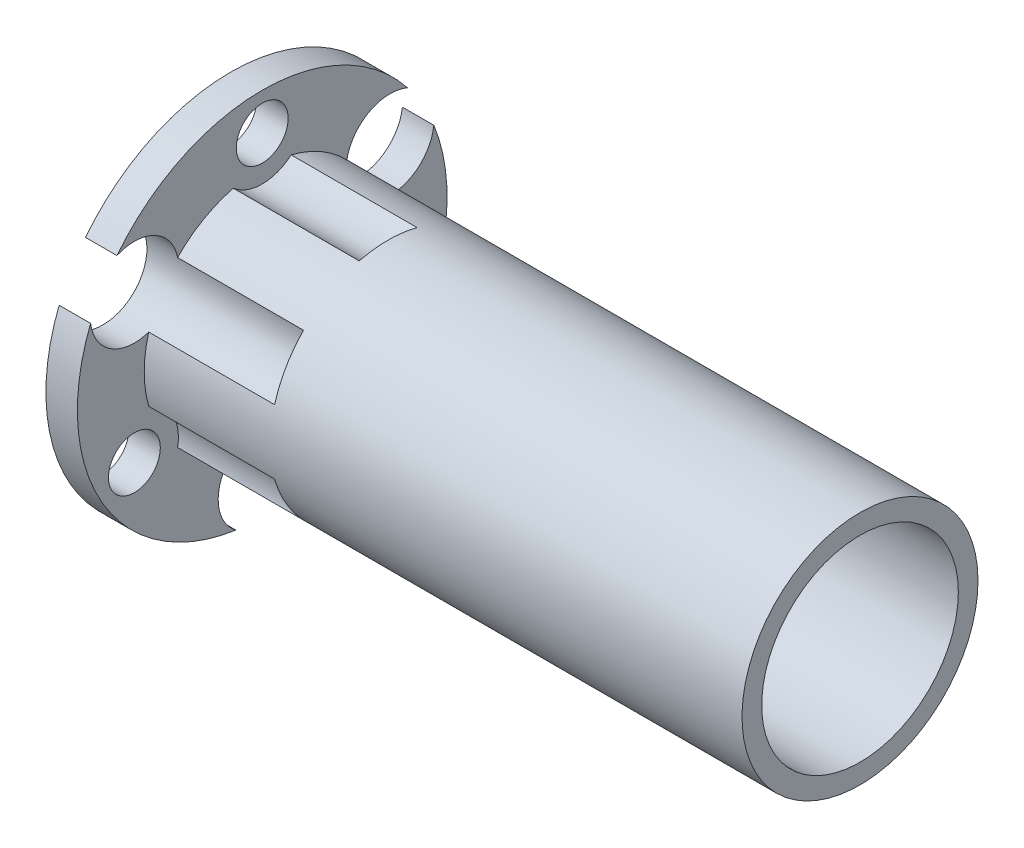
ISO-10303-21;
HEADER;
FILE_DESCRIPTION(('STEP AP214'),'2;1');
FILE_NAME('part.step','',(''),(''),'','','');
FILE_SCHEMA(('AUTOMOTIVE_DESIGN { 1 0 10303 214 1 1 1 1 }'));
ENDSEC;
DATA;
#1=APPLICATION_CONTEXT('core data for automotive mechanical design processes');
#2=APPLICATION_PROTOCOL_DEFINITION('international standard','automotive_design',2000,#1);
#3=PRODUCT_CONTEXT('',#1,'mechanical');
#4=PRODUCT('Part','Part','',(#3));
#5=PRODUCT_RELATED_PRODUCT_CATEGORY('part','',(#4));
#6=PRODUCT_DEFINITION_FORMATION('','',#4);
#7=PRODUCT_DEFINITION_CONTEXT('part definition',#1,'design');
#8=PRODUCT_DEFINITION('design','',#6,#7);
#9=PRODUCT_DEFINITION_SHAPE('','',#8);
#10=(LENGTH_UNIT() NAMED_UNIT(*) SI_UNIT(.MILLI.,.METRE.));
#11=(NAMED_UNIT(*) PLANE_ANGLE_UNIT() SI_UNIT($,.RADIAN.));
#12=(NAMED_UNIT(*) SI_UNIT($,.STERADIAN.) SOLID_ANGLE_UNIT());
#13=UNCERTAINTY_MEASURE_WITH_UNIT(LENGTH_MEASURE(1.E-05),#10,'distance_accuracy_value','');
#14=(GEOMETRIC_REPRESENTATION_CONTEXT(3) GLOBAL_UNCERTAINTY_ASSIGNED_CONTEXT((#13)) GLOBAL_UNIT_ASSIGNED_CONTEXT((#10,
#11,#12)) REPRESENTATION_CONTEXT('',''));
#15=CARTESIAN_POINT('',(0.,0.,0.));
#16=DIRECTION('',(0.,0.,1.));
#17=DIRECTION('',(1.,0.,0.));
#18=AXIS2_PLACEMENT_3D('',#15,#16,#17);
#19=CARTESIAN_POINT('',(2.,0.,0.));
#20=DIRECTION('',(-1.,0.,0.));
#21=DIRECTION('',(0.,0.,1.));
#22=AXIS2_PLACEMENT_3D('',#19,#20,#21);
#23=CYLINDRICAL_SURFACE('',#22,7.5);
#24=CARTESIAN_POINT('',(40.,0.,0.));
#25=DIRECTION('',(1.,0.,0.));
#26=DIRECTION('',(0.,0.,-1.));
#27=AXIS2_PLACEMENT_3D('',#24,#25,#26);
#28=CIRCLE('',#27,7.5);
#29=CARTESIAN_POINT('',(40.,0.,-7.5));
#30=VERTEX_POINT('',#29);
#31=EDGE_CURVE('E295',#30,#30,#28,.T.);
#32=ORIENTED_EDGE('',*,*,#31,.F.);
#33=EDGE_LOOP('',(#32));
#34=FACE_BOUND('',#33,.T.);
#35=DIRECTION('',(-1.,0.,0.));
#36=VECTOR('',#35,1.);
#37=CARTESIAN_POINT('',(6.,-7.27161561001598,1.83673798353818));
#38=LINE('',#37,#36);
#39=CARTESIAN_POINT('',(10.,-7.27161561001598,1.83673798353818));
#40=VERTEX_POINT('',#39);
#41=CARTESIAN_POINT('',(2.,-7.27161561001598,1.83673798353818));
#42=VERTEX_POINT('',#41);
#43=EDGE_CURVE('E52',#40,#42,#38,.T.);
#44=ORIENTED_EDGE('',*,*,#43,.F.);
#45=CARTESIAN_POINT('',(10.,0.,0.));
#46=DIRECTION('',(1.,0.,0.));
#47=DIRECTION('',(0.,0.,-1.));
#48=AXIS2_PLACEMENT_3D('',#45,#46,#47);
#49=CIRCLE('',#48,7.5);
#50=CARTESIAN_POINT('',(10.,-7.27161561001598,-1.83673798353818));
#51=VERTEX_POINT('',#50);
#52=EDGE_CURVE('E11',#40,#51,#49,.T.);
#53=ORIENTED_EDGE('',*,*,#52,.T.);
#54=DIRECTION('',(-1.,0.,0.));
#55=VECTOR('',#54,1.);
#56=CARTESIAN_POINT('',(6.,-7.27161561001598,-1.83673798353818));
#57=LINE('',#56,#55);
#58=CARTESIAN_POINT('',(2.,-7.27161561001598,-1.83673798353818));
#59=VERTEX_POINT('',#58);
#60=EDGE_CURVE('E182',#59,#51,#57,.F.);
#61=ORIENTED_EDGE('',*,*,#60,.F.);
#62=CARTESIAN_POINT('',(2.,0.,0.));
#63=DIRECTION('',(1.,0.,0.));
#64=DIRECTION('',(0.,0.,-1.));
#65=AXIS2_PLACEMENT_3D('',#62,#63,#64);
#66=CIRCLE('',#65,7.5);
#67=CARTESIAN_POINT('',(2.,-5.22646955884792,-5.37903485306017));
#68=VERTEX_POINT('',#67);
#69=EDGE_CURVE('E379',#68,#59,#66,.F.);
#70=ORIENTED_EDGE('',*,*,#69,.F.);
#71=DIRECTION('',(-1.,0.,0.));
#72=VECTOR('',#71,1.);
#73=CARTESIAN_POINT('',(10.,-5.22646955884792,-5.37903485306017));
#74=LINE('',#73,#72);
#75=CARTESIAN_POINT('',(10.,-5.22646955884792,-5.37903485306017));
#76=VERTEX_POINT('',#75);
#77=EDGE_CURVE('E328',#76,#68,#74,.T.);
#78=ORIENTED_EDGE('',*,*,#77,.F.);
#79=CARTESIAN_POINT('',(10.,0.,0.));
#80=DIRECTION('',(1.,0.,0.));
#81=DIRECTION('',(0.,0.,-1.));
#82=AXIS2_PLACEMENT_3D('',#79,#80,#81);
#83=CIRCLE('',#82,7.5);
#84=CARTESIAN_POINT('',(10.,-2.04514605116821,-7.21577283659838));
#85=VERTEX_POINT('',#84);
#86=EDGE_CURVE('E335',#76,#85,#83,.T.);
#87=ORIENTED_EDGE('',*,*,#86,.T.);
#88=DIRECTION('',(-1.,0.,0.));
#89=VECTOR('',#88,1.);
#90=CARTESIAN_POINT('',(10.,-2.04514605116821,-7.21577283659838));
#91=LINE('',#90,#89);
#92=CARTESIAN_POINT('',(2.,-2.04514605116821,-7.21577283659838));
#93=VERTEX_POINT('',#92);
#94=EDGE_CURVE('E339',#85,#93,#91,.T.);
#95=ORIENTED_EDGE('',*,*,#94,.T.);
#96=CARTESIAN_POINT('',(2.,2.04514605116806,-7.21577283659843));
#97=VERTEX_POINT('',#96);
#98=EDGE_CURVE('E380',#97,#93,#66,.F.);
#99=ORIENTED_EDGE('',*,*,#98,.F.);
#100=DIRECTION('',(-1.,0.,0.));
#101=VECTOR('',#100,1.);
#102=CARTESIAN_POINT('',(10.,2.04514605116806,-7.21577283659843));
#103=LINE('',#102,#101);
#104=CARTESIAN_POINT('',(10.,2.04514605116806,-7.21577283659843));
#105=VERTEX_POINT('',#104);
#106=EDGE_CURVE('E342',#105,#97,#103,.T.);
#107=ORIENTED_EDGE('',*,*,#106,.F.);
#108=CARTESIAN_POINT('',(10.,0.,0.));
#109=DIRECTION('',(1.,0.,0.));
#110=DIRECTION('',(0.,0.,-1.));
#111=AXIS2_PLACEMENT_3D('',#108,#109,#110);
#112=CIRCLE('',#111,7.5);
#113=CARTESIAN_POINT('',(10.,5.22646955884781,-5.37903485306028));
#114=VERTEX_POINT('',#113);
#115=EDGE_CURVE('E351',#105,#114,#112,.T.);
#116=ORIENTED_EDGE('',*,*,#115,.T.);
#117=DIRECTION('',(-1.,0.,0.));
#118=VECTOR('',#117,1.);
#119=CARTESIAN_POINT('',(10.,5.22646955884781,-5.37903485306028));
#120=LINE('',#119,#118);
#121=CARTESIAN_POINT('',(2.,5.22646955884781,-5.37903485306028));
#122=VERTEX_POINT('',#121);
#123=EDGE_CURVE('E356',#114,#122,#120,.T.);
#124=ORIENTED_EDGE('',*,*,#123,.T.);
#125=CARTESIAN_POINT('',(2.,7.27161561001597,-1.83673798353823));
#126=VERTEX_POINT('',#125);
#127=EDGE_CURVE('E192',#126,#122,#66,.F.);
#128=ORIENTED_EDGE('',*,*,#127,.F.);
#129=DIRECTION('',(-1.,0.,0.));
#130=VECTOR('',#129,1.);
#131=CARTESIAN_POINT('',(10.,7.27161561001597,-1.83673798353823));
#132=LINE('',#131,#130);
#133=CARTESIAN_POINT('',(10.,7.27161561001597,-1.83673798353823));
#134=VERTEX_POINT('',#133);
#135=EDGE_CURVE('E352',#134,#126,#132,.T.);
#136=ORIENTED_EDGE('',*,*,#135,.F.);
#137=CARTESIAN_POINT('',(10.,0.,0.));
#138=DIRECTION('',(1.,0.,0.));
#139=DIRECTION('',(0.,0.,-1.));
#140=AXIS2_PLACEMENT_3D('',#137,#138,#139);
#141=CIRCLE('',#140,7.5);
#142=CARTESIAN_POINT('',(10.,7.271615610016,1.83673798353813));
#143=VERTEX_POINT('',#142);
#144=EDGE_CURVE('E365',#134,#143,#141,.T.);
#145=ORIENTED_EDGE('',*,*,#144,.T.);
#146=DIRECTION('',(-1.,0.,0.));
#147=VECTOR('',#146,1.);
#148=CARTESIAN_POINT('',(10.,7.271615610016,1.83673798353813));
#149=LINE('',#148,#147);
#150=CARTESIAN_POINT('',(2.,7.271615610016,1.83673798353813));
#151=VERTEX_POINT('',#150);
#152=EDGE_CURVE('E368',#143,#151,#149,.T.);
#153=ORIENTED_EDGE('',*,*,#152,.T.);
#154=CARTESIAN_POINT('',(2.,5.22646955884788,5.37903485306021));
#155=VERTEX_POINT('',#154);
#156=EDGE_CURVE('E191',#155,#151,#66,.F.);
#157=ORIENTED_EDGE('',*,*,#156,.F.);
#158=DIRECTION('',(-1.,0.,0.));
#159=VECTOR('',#158,1.);
#160=CARTESIAN_POINT('',(10.,5.22646955884788,5.37903485306021));
#161=LINE('',#160,#159);
#162=CARTESIAN_POINT('',(10.,5.22646955884788,5.37903485306021));
#163=VERTEX_POINT('',#162);
#164=EDGE_CURVE('E317',#163,#155,#161,.T.);
#165=ORIENTED_EDGE('',*,*,#164,.F.);
#166=CARTESIAN_POINT('',(10.,0.,0.));
#167=DIRECTION('',(1.,0.,0.));
#168=DIRECTION('',(0.,0.,-1.));
#169=AXIS2_PLACEMENT_3D('',#166,#167,#168);
#170=CIRCLE('',#169,7.5);
#171=CARTESIAN_POINT('',(10.,2.04514605116816,7.2157728365984));
#172=VERTEX_POINT('',#171);
#173=EDGE_CURVE('E310',#163,#172,#170,.T.);
#174=ORIENTED_EDGE('',*,*,#173,.T.);
#175=DIRECTION('',(-1.,0.,0.));
#176=VECTOR('',#175,1.);
#177=CARTESIAN_POINT('',(10.,2.04514605116816,7.2157728365984));
#178=LINE('',#177,#176);
#179=CARTESIAN_POINT('',(2.,2.04514605116816,7.2157728365984));
#180=VERTEX_POINT('',#179);
#181=EDGE_CURVE('E314',#172,#180,#178,.T.);
#182=ORIENTED_EDGE('',*,*,#181,.T.);
#183=CARTESIAN_POINT('',(2.,-2.04514605116801,7.21577283659844));
#184=VERTEX_POINT('',#183);
#185=EDGE_CURVE('E189',#184,#180,#66,.F.);
#186=ORIENTED_EDGE('',*,*,#185,.F.);
#187=DIRECTION('',(-1.,0.,0.));
#188=VECTOR('',#187,1.);
#189=CARTESIAN_POINT('',(10.,-2.045146051168,7.21577283659844));
#190=LINE('',#189,#188);
#191=CARTESIAN_POINT('',(10.,-2.045146051168,7.21577283659844));
#192=VERTEX_POINT('',#191);
#193=EDGE_CURVE('E296',#192,#184,#190,.T.);
#194=ORIENTED_EDGE('',*,*,#193,.F.);
#195=CARTESIAN_POINT('',(10.,0.,0.));
#196=DIRECTION('',(1.,0.,0.));
#197=DIRECTION('',(0.,0.,-1.));
#198=AXIS2_PLACEMENT_3D('',#195,#196,#197);
#199=CIRCLE('',#198,7.5);
#200=CARTESIAN_POINT('',(10.,-5.22646955884777,5.37903485306032));
#201=VERTEX_POINT('',#200);
#202=EDGE_CURVE('E324',#192,#201,#199,.T.);
#203=ORIENTED_EDGE('',*,*,#202,.T.);
#204=DIRECTION('',(-1.,0.,0.));
#205=VECTOR('',#204,1.);
#206=CARTESIAN_POINT('',(10.,-5.22646955884777,5.37903485306032));
#207=LINE('',#206,#205);
#208=CARTESIAN_POINT('',(2.,-5.22646955884777,5.37903485306032));
#209=VERTEX_POINT('',#208);
#210=EDGE_CURVE('E186',#201,#209,#207,.T.);
#211=ORIENTED_EDGE('',*,*,#210,.T.);
#212=EDGE_CURVE('E184',#42,#209,#66,.F.);
#213=ORIENTED_EDGE('',*,*,#212,.F.);
#214=EDGE_LOOP('',(#44,#53,#61,#70,#78,#87,#95,#99,#107,#116,#124,#128,#136,#145,#153,#157,#165,
#174,#182,#186,#194,#203,#211,#213));
#215=FACE_BOUND('',#214,.T.);
#216=ADVANCED_FACE('F43',(#34,#215),#23,.T.);
#217=CARTESIAN_POINT('',(2.,0.,0.));
#218=DIRECTION('',(1.,0.,0.));
#219=DIRECTION('',(0.,0.,-1.));
#220=AXIS2_PLACEMENT_3D('',#217,#218,#219);
#221=PLANE('',#220);
#222=CARTESIAN_POINT('',(2.,-4.6925,8.12764841451695));
#223=DIRECTION('',(1.,0.,0.));
#224=DIRECTION('',(0.,0.,-1.));
#225=AXIS2_PLACEMENT_3D('',#222,#223,#224);
#226=CIRCLE('',#225,1.65);
#227=CARTESIAN_POINT('',(2.,-4.6925,6.47764841451695));
#228=VERTEX_POINT('',#227);
#229=EDGE_CURVE('E217',#228,#228,#226,.T.);
#230=ORIENTED_EDGE('',*,*,#229,.F.);
#231=EDGE_LOOP('',(#230));
#232=FACE_BOUND('',#231,.T.);
#233=CARTESIAN_POINT('',(2.,-9.385,0.));
#234=DIRECTION('',(1.,0.,0.));
#235=DIRECTION('',(0.,0.,-1.));
#236=AXIS2_PLACEMENT_3D('',#233,#234,#235);
#237=CIRCLE('',#236,2.8);
#238=CARTESIAN_POINT('',(2.,-11.630299680341,1.6729104415541));
#239=VERTEX_POINT('',#238);
#240=EDGE_CURVE('E177',#42,#239,#237,.T.);
#241=ORIENTED_EDGE('',*,*,#240,.F.);
#242=ORIENTED_EDGE('',*,*,#212,.T.);
#243=CARTESIAN_POINT('',(2.,-4.69249999999986,8.12764841451703));
#244=DIRECTION('',(1.,0.,0.));
#245=DIRECTION('',(0.,0.,-1.));
#246=AXIS2_PLACEMENT_3D('',#243,#244,#245);
#247=CIRCLE('',#246,2.8);
#248=EDGE_CURVE('E67',#209,#184,#247,.T.);
#249=ORIENTED_EDGE('',*,*,#248,.T.);
#250=ORIENTED_EDGE('',*,*,#185,.T.);
#251=CARTESIAN_POINT('',(2.,4.69250000000004,8.12764841451694));
#252=DIRECTION('',(1.,0.,0.));
#253=DIRECTION('',(0.,0.,-1.));
#254=AXIS2_PLACEMENT_3D('',#251,#252,#253);
#255=CIRCLE('',#254,2.8);
#256=CARTESIAN_POINT('',(2.,4.36636689952844,10.9085901975783));
#257=VERTEX_POINT('',#256);
#258=EDGE_CURVE('E207',#257,#180,#255,.T.);
#259=ORIENTED_EDGE('',*,*,#258,.F.);
#260=CARTESIAN_POINT('',(2.,0.,0.));
#261=DIRECTION('',(1.,0.,0.));
#262=DIRECTION('',(0.,0.,-1.));
#263=AXIS2_PLACEMENT_3D('',#260,#261,#262);
#264=CIRCLE('',#263,11.75);
#265=EDGE_CURVE('E196',#257,#239,#264,.T.);
#266=ORIENTED_EDGE('',*,*,#265,.T.);
#267=EDGE_LOOP('',(#241,#242,#249,#250,#259,#266));
#268=FACE_BOUND('',#267,.T.);
#269=ADVANCED_FACE('F193',(#232,#268),#221,.T.);
#270=CARTESIAN_POINT('',(2.,9.385,0.));
#271=DIRECTION('',(1.,0.,0.));
#272=DIRECTION('',(0.,0.,-1.));
#273=AXIS2_PLACEMENT_3D('',#270,#271,#272);
#274=CIRCLE('',#273,1.65);
#275=CARTESIAN_POINT('',(2.,9.385,-1.65));
#276=VERTEX_POINT('',#275);
#277=EDGE_CURVE('E225',#276,#276,#274,.T.);
#278=ORIENTED_EDGE('',*,*,#277,.F.);
#279=EDGE_LOOP('',(#278));
#280=FACE_BOUND('',#279,.T.);
#281=CARTESIAN_POINT('',(2.,4.69250000000004,8.12764841451694));
#282=DIRECTION('',(1.,0.,0.));
#283=DIRECTION('',(0.,0.,-1.));
#284=AXIS2_PLACEMENT_3D('',#281,#282,#283);
#285=CIRCLE('',#284,2.8);
#286=CARTESIAN_POINT('',(2.,7.26393278081262,9.23567975602423));
#287=VERTEX_POINT('',#286);
#288=EDGE_CURVE('E389',#155,#287,#285,.T.);
#289=ORIENTED_EDGE('',*,*,#288,.F.);
#290=ORIENTED_EDGE('',*,*,#156,.T.);
#291=CARTESIAN_POINT('',(2.,9.385,0.));
#292=DIRECTION('',(1.,0.,0.));
#293=DIRECTION('',(0.,0.,-1.));
#294=AXIS2_PLACEMENT_3D('',#291,#292,#293);
#295=CIRCLE('',#294,2.8);
#296=EDGE_CURVE('E320',#151,#126,#295,.T.);
#297=ORIENTED_EDGE('',*,*,#296,.T.);
#298=ORIENTED_EDGE('',*,*,#127,.T.);
#299=CARTESIAN_POINT('',(2.,4.69249999999993,-8.127648414517));
#300=DIRECTION('',(1.,0.,0.));
#301=DIRECTION('',(0.,0.,-1.));
#302=AXIS2_PLACEMENT_3D('',#299,#300,#301);
#303=CIRCLE('',#302,2.8);
#304=CARTESIAN_POINT('',(2.,7.26393278081249,-9.23567975602434));
#305=VERTEX_POINT('',#304);
#306=EDGE_CURVE('E267',#305,#122,#303,.T.);
#307=ORIENTED_EDGE('',*,*,#306,.F.);
#308=CARTESIAN_POINT('',(2.,0.,0.));
#309=DIRECTION('',(1.,0.,0.));
#310=DIRECTION('',(0.,0.,-1.));
#311=AXIS2_PLACEMENT_3D('',#308,#309,#310);
#312=CIRCLE('',#311,11.75);
#313=EDGE_CURVE('E386',#305,#287,#312,.T.);
#314=ORIENTED_EDGE('',*,*,#313,.T.);
#315=EDGE_LOOP('',(#289,#290,#297,#298,#307,#314));
#316=FACE_BOUND('',#315,.T.);
#317=ADVANCED_FACE('F433',(#280,#316),#221,.T.);
#318=CARTESIAN_POINT('',(2.,-4.6925,-8.12764841451696));
#319=DIRECTION('',(1.,0.,0.));
#320=DIRECTION('',(0.,0.,-1.));
#321=AXIS2_PLACEMENT_3D('',#318,#319,#320);
#322=CIRCLE('',#321,1.65);
#323=CARTESIAN_POINT('',(2.,-4.6925,-9.77764841451696));
#324=VERTEX_POINT('',#323);
#325=EDGE_CURVE('E221',#324,#324,#322,.T.);
#326=ORIENTED_EDGE('',*,*,#325,.F.);
#327=EDGE_LOOP('',(#326));
#328=FACE_BOUND('',#327,.T.);
#329=CARTESIAN_POINT('',(2.,4.69249999999993,-8.127648414517));
#330=DIRECTION('',(1.,0.,0.));
#331=DIRECTION('',(0.,0.,-1.));
#332=AXIS2_PLACEMENT_3D('',#329,#330,#331);
#333=CIRCLE('',#332,2.8);
#334=CARTESIAN_POINT('',(2.,4.36636689952829,-10.9085901975784));
#335=VERTEX_POINT('',#334);
#336=EDGE_CURVE('E213',#97,#335,#333,.T.);
#337=ORIENTED_EDGE('',*,*,#336,.F.);
#338=ORIENTED_EDGE('',*,*,#98,.T.);
#339=CARTESIAN_POINT('',(2.,-4.69250000000009,-8.1276484145169));
#340=DIRECTION('',(1.,0.,0.));
#341=DIRECTION('',(0.,0.,-1.));
#342=AXIS2_PLACEMENT_3D('',#339,#340,#341);
#343=CIRCLE('',#342,2.8);
#344=EDGE_CURVE('E59',#93,#68,#343,.T.);
#345=ORIENTED_EDGE('',*,*,#344,.T.);
#346=ORIENTED_EDGE('',*,*,#69,.T.);
#347=CARTESIAN_POINT('',(2.,-9.385,0.));
#348=DIRECTION('',(1.,0.,0.));
#349=DIRECTION('',(0.,0.,-1.));
#350=AXIS2_PLACEMENT_3D('',#347,#348,#349);
#351=CIRCLE('',#350,2.8);
#352=CARTESIAN_POINT('',(2.,-11.630299680341,-1.6729104415541));
#353=VERTEX_POINT('',#352);
#354=EDGE_CURVE('E199',#353,#59,#351,.T.);
#355=ORIENTED_EDGE('',*,*,#354,.F.);
#356=CARTESIAN_POINT('',(2.,0.,0.));
#357=DIRECTION('',(1.,0.,0.));
#358=DIRECTION('',(0.,0.,-1.));
#359=AXIS2_PLACEMENT_3D('',#356,#357,#358);
#360=CIRCLE('',#359,11.75);
#361=EDGE_CURVE('E205',#353,#335,#360,.T.);
#362=ORIENTED_EDGE('',*,*,#361,.T.);
#363=EDGE_LOOP('',(#337,#338,#345,#346,#355,#362));
#364=FACE_BOUND('',#363,.T.);
#365=ADVANCED_FACE('F407',(#328,#364),#221,.T.);
#366=CARTESIAN_POINT('',(2.,0.,0.));
#367=DIRECTION('',(-1.,0.,0.));
#368=DIRECTION('',(0.,0.,1.));
#369=AXIS2_PLACEMENT_3D('',#366,#367,#368);
#370=CYLINDRICAL_SURFACE('',#369,11.75);
#371=CARTESIAN_POINT('',(0.,0.,0.));
#372=DIRECTION('',(1.,0.,0.));
#373=DIRECTION('',(0.,0.,-1.));
#374=AXIS2_PLACEMENT_3D('',#371,#372,#373);
#375=CIRCLE('',#374,11.75);
#376=CARTESIAN_POINT('',(0.,7.26393278081249,-9.23567975602434));
#377=VERTEX_POINT('',#376);
#378=CARTESIAN_POINT('',(0.,7.26393278081262,9.23567975602423));
#379=VERTEX_POINT('',#378);
#380=EDGE_CURVE('E188',#377,#379,#375,.T.);
#381=ORIENTED_EDGE('',*,*,#380,.T.);
#382=DIRECTION('',(-1.,0.,0.));
#383=VECTOR('',#382,1.);
#384=CARTESIAN_POINT('',(2.,7.26393278081262,9.23567975602423));
#385=LINE('',#384,#383);
#386=EDGE_CURVE('E279',#287,#379,#385,.T.);
#387=ORIENTED_EDGE('',*,*,#386,.F.);
#388=ORIENTED_EDGE('',*,*,#313,.F.);
#389=DIRECTION('',(-1.,0.,0.));
#390=VECTOR('',#389,1.);
#391=CARTESIAN_POINT('',(2.,7.26393278081249,-9.23567975602434));
#392=LINE('',#391,#390);
#393=EDGE_CURVE('E283',#305,#377,#392,.T.);
#394=ORIENTED_EDGE('',*,*,#393,.T.);
#395=EDGE_LOOP('',(#381,#387,#388,#394));
#396=FACE_BOUND('',#395,.T.);
#397=ADVANCED_FACE('F45',(#396),#370,.T.);
#398=CARTESIAN_POINT('',(2.,4.69250000000004,8.12764841451694));
#399=DIRECTION('',(-1.,0.,0.));
#400=DIRECTION('',(0.,0.,1.));
#401=AXIS2_PLACEMENT_3D('',#398,#399,#400);
#402=CYLINDRICAL_SURFACE('',#401,2.8);
#403=CARTESIAN_POINT('',(0.,4.69250000000004,8.12764841451694));
#404=DIRECTION('',(1.,0.,0.));
#405=DIRECTION('',(0.,0.,-1.));
#406=AXIS2_PLACEMENT_3D('',#403,#404,#405);
#407=CIRCLE('',#406,2.8);
#408=CARTESIAN_POINT('',(0.,4.36636689952844,10.9085901975783));
#409=VERTEX_POINT('',#408);
#410=EDGE_CURVE('E233',#409,#379,#407,.T.);
#411=ORIENTED_EDGE('',*,*,#410,.F.);
#412=DIRECTION('',(-1.,0.,0.));
#413=VECTOR('',#412,1.);
#414=CARTESIAN_POINT('',(2.,4.36636689952844,10.9085901975783));
#415=LINE('',#414,#413);
#416=EDGE_CURVE('E276',#257,#409,#415,.T.);
#417=ORIENTED_EDGE('',*,*,#416,.F.);
#418=ORIENTED_EDGE('',*,*,#258,.T.);
#419=ORIENTED_EDGE('',*,*,#181,.F.);
#420=CARTESIAN_POINT('',(10.,4.69250000000004,8.12764841451694));
#421=DIRECTION('',(1.,0.,0.));
#422=DIRECTION('',(0.,0.,-1.));
#423=AXIS2_PLACEMENT_3D('',#420,#421,#422);
#424=CIRCLE('',#423,2.8);
#425=EDGE_CURVE('E306',#172,#163,#424,.T.);
#426=ORIENTED_EDGE('',*,*,#425,.T.);
#427=ORIENTED_EDGE('',*,*,#164,.T.);
#428=ORIENTED_EDGE('',*,*,#288,.T.);
#429=ORIENTED_EDGE('',*,*,#386,.T.);
#430=EDGE_LOOP('',(#411,#417,#418,#419,#426,#427,#428,#429));
#431=FACE_BOUND('',#430,.T.);
#432=ADVANCED_FACE('F396',(#431),#402,.F.);
#433=CARTESIAN_POINT('',(2.,0.,0.));
#434=DIRECTION('',(-1.,0.,0.));
#435=DIRECTION('',(0.,0.,1.));
#436=AXIS2_PLACEMENT_3D('',#433,#434,#435);
#437=CYLINDRICAL_SURFACE('',#436,11.75);
#438=CARTESIAN_POINT('',(0.,0.,0.));
#439=DIRECTION('',(1.,0.,0.));
#440=DIRECTION('',(0.,0.,-1.));
#441=AXIS2_PLACEMENT_3D('',#438,#439,#440);
#442=CIRCLE('',#441,11.75);
#443=CARTESIAN_POINT('',(0.,-11.630299680341,1.6729104415541));
#444=VERTEX_POINT('',#443);
#445=EDGE_CURVE('E236',#409,#444,#442,.T.);
#446=ORIENTED_EDGE('',*,*,#445,.T.);
#447=DIRECTION('',(-1.,0.,0.));
#448=VECTOR('',#447,1.);
#449=CARTESIAN_POINT('',(2.,-11.630299680341,1.6729104415541));
#450=LINE('',#449,#448);
#451=EDGE_CURVE('E273',#239,#444,#450,.T.);
#452=ORIENTED_EDGE('',*,*,#451,.F.);
#453=ORIENTED_EDGE('',*,*,#265,.F.);
#454=ORIENTED_EDGE('',*,*,#416,.T.);
#455=EDGE_LOOP('',(#446,#452,#453,#454));
#456=FACE_BOUND('',#455,.T.);
#457=ADVANCED_FACE('F452',(#456),#437,.T.);
#458=CARTESIAN_POINT('',(2.,-9.385,0.));
#459=DIRECTION('',(-1.,0.,0.));
#460=DIRECTION('',(0.,0.,1.));
#461=AXIS2_PLACEMENT_3D('',#458,#459,#460);
#462=CYLINDRICAL_SURFACE('',#461,2.8);
#463=CARTESIAN_POINT('',(0.,-9.385,0.));
#464=DIRECTION('',(1.,0.,0.));
#465=DIRECTION('',(0.,0.,-1.));
#466=AXIS2_PLACEMENT_3D('',#463,#464,#465);
#467=CIRCLE('',#466,2.8);
#468=CARTESIAN_POINT('',(0.,-11.630299680341,-1.6729104415541));
#469=VERTEX_POINT('',#468);
#470=EDGE_CURVE('E240',#469,#444,#467,.T.);
#471=ORIENTED_EDGE('',*,*,#470,.F.);
#472=DIRECTION('',(-1.,0.,0.));
#473=VECTOR('',#472,1.);
#474=CARTESIAN_POINT('',(2.,-11.630299680341,-1.6729104415541));
#475=LINE('',#474,#473);
#476=EDGE_CURVE('E270',#353,#469,#475,.T.);
#477=ORIENTED_EDGE('',*,*,#476,.F.);
#478=ORIENTED_EDGE('',*,*,#354,.T.);
#479=ORIENTED_EDGE('',*,*,#60,.T.);
#480=CARTESIAN_POINT('',(10.,-9.385,0.));
#481=DIRECTION('',(1.,0.,0.));
#482=DIRECTION('',(0.,0.,-1.));
#483=AXIS2_PLACEMENT_3D('',#480,#481,#482);
#484=CIRCLE('',#483,2.8);
#485=EDGE_CURVE('E179',#51,#40,#484,.T.);
#486=ORIENTED_EDGE('',*,*,#485,.T.);
#487=ORIENTED_EDGE('',*,*,#43,.T.);
#488=ORIENTED_EDGE('',*,*,#240,.T.);
#489=ORIENTED_EDGE('',*,*,#451,.T.);
#490=EDGE_LOOP('',(#471,#477,#478,#479,#486,#487,#488,#489));
#491=FACE_BOUND('',#490,.T.);
#492=ADVANCED_FACE('F174',(#491),#462,.F.);
#493=CARTESIAN_POINT('',(2.,0.,0.));
#494=DIRECTION('',(-1.,0.,0.));
#495=DIRECTION('',(0.,0.,1.));
#496=AXIS2_PLACEMENT_3D('',#493,#494,#495);
#497=CYLINDRICAL_SURFACE('',#496,11.75);
#498=CARTESIAN_POINT('',(0.,0.,0.));
#499=DIRECTION('',(1.,0.,0.));
#500=DIRECTION('',(0.,0.,-1.));
#501=AXIS2_PLACEMENT_3D('',#498,#499,#500);
#502=CIRCLE('',#501,11.75);
#503=CARTESIAN_POINT('',(0.,4.36636689952829,-10.9085901975784));
#504=VERTEX_POINT('',#503);
#505=EDGE_CURVE('E243',#469,#504,#502,.T.);
#506=ORIENTED_EDGE('',*,*,#505,.T.);
#507=DIRECTION('',(-1.,0.,0.));
#508=VECTOR('',#507,1.);
#509=CARTESIAN_POINT('',(2.,4.36636689952829,-10.9085901975784));
#510=LINE('',#509,#508);
#511=EDGE_CURVE('E229',#335,#504,#510,.T.);
#512=ORIENTED_EDGE('',*,*,#511,.F.);
#513=ORIENTED_EDGE('',*,*,#361,.F.);
#514=ORIENTED_EDGE('',*,*,#476,.T.);
#515=EDGE_LOOP('',(#506,#512,#513,#514));
#516=FACE_BOUND('',#515,.T.);
#517=ADVANCED_FACE('F445',(#516),#497,.T.);
#518=CARTESIAN_POINT('',(2.,4.69249999999993,-8.127648414517));
#519=DIRECTION('',(-1.,0.,0.));
#520=DIRECTION('',(0.,0.,1.));
#521=AXIS2_PLACEMENT_3D('',#518,#519,#520);
#522=CYLINDRICAL_SURFACE('',#521,2.8);
#523=CARTESIAN_POINT('',(0.,4.69249999999993,-8.127648414517));
#524=DIRECTION('',(1.,0.,0.));
#525=DIRECTION('',(0.,0.,-1.));
#526=AXIS2_PLACEMENT_3D('',#523,#524,#525);
#527=CIRCLE('',#526,2.8);
#528=EDGE_CURVE('E247',#377,#504,#527,.T.);
#529=ORIENTED_EDGE('',*,*,#528,.F.);
#530=ORIENTED_EDGE('',*,*,#393,.F.);
#531=ORIENTED_EDGE('',*,*,#306,.T.);
#532=ORIENTED_EDGE('',*,*,#123,.F.);
#533=CARTESIAN_POINT('',(10.,4.69249999999993,-8.127648414517));
#534=DIRECTION('',(1.,0.,0.));
#535=DIRECTION('',(0.,0.,-1.));
#536=AXIS2_PLACEMENT_3D('',#533,#534,#535);
#537=CIRCLE('',#536,2.8);
#538=EDGE_CURVE('E347',#114,#105,#537,.T.);
#539=ORIENTED_EDGE('',*,*,#538,.T.);
#540=ORIENTED_EDGE('',*,*,#106,.T.);
#541=ORIENTED_EDGE('',*,*,#336,.T.);
#542=ORIENTED_EDGE('',*,*,#511,.T.);
#543=EDGE_LOOP('',(#529,#530,#531,#532,#539,#540,#541,#542));
#544=FACE_BOUND('',#543,.T.);
#545=ADVANCED_FACE('F441',(#544),#522,.F.);
#546=CARTESIAN_POINT('',(2.,-4.6925,-8.12764841451696));
#547=DIRECTION('',(-1.,0.,0.));
#548=DIRECTION('',(0.,0.,1.));
#549=AXIS2_PLACEMENT_3D('',#546,#547,#548);
#550=CYLINDRICAL_SURFACE('',#549,1.65);
#551=ORIENTED_EDGE('',*,*,#325,.T.);
#552=EDGE_LOOP('',(#551));
#553=FACE_BOUND('',#552,.T.);
#554=CARTESIAN_POINT('',(0.,-4.6925,-8.12764841451696));
#555=DIRECTION('',(1.,0.,0.));
#556=DIRECTION('',(0.,0.,-1.));
#557=AXIS2_PLACEMENT_3D('',#554,#555,#556);
#558=CIRCLE('',#557,1.65);
#559=CARTESIAN_POINT('',(0.,-4.6925,-9.77764841451696));
#560=VERTEX_POINT('',#559);
#561=EDGE_CURVE('E259',#560,#560,#558,.T.);
#562=ORIENTED_EDGE('',*,*,#561,.F.);
#563=EDGE_LOOP('',(#562));
#564=FACE_BOUND('',#563,.T.);
#565=ADVANCED_FACE('F444',(#553,#564),#550,.F.);
#566=CARTESIAN_POINT('',(2.,-4.6925,8.12764841451695));
#567=DIRECTION('',(-1.,0.,0.));
#568=DIRECTION('',(0.,0.,1.));
#569=AXIS2_PLACEMENT_3D('',#566,#567,#568);
#570=CYLINDRICAL_SURFACE('',#569,1.65);
#571=ORIENTED_EDGE('',*,*,#229,.T.);
#572=EDGE_LOOP('',(#571));
#573=FACE_BOUND('',#572,.T.);
#574=CARTESIAN_POINT('',(0.,-4.6925,8.12764841451695));
#575=DIRECTION('',(1.,0.,0.));
#576=DIRECTION('',(0.,0.,-1.));
#577=AXIS2_PLACEMENT_3D('',#574,#575,#576);
#578=CIRCLE('',#577,1.65);
#579=CARTESIAN_POINT('',(0.,-4.6925,6.47764841451695));
#580=VERTEX_POINT('',#579);
#581=EDGE_CURVE('E255',#580,#580,#578,.T.);
#582=ORIENTED_EDGE('',*,*,#581,.F.);
#583=EDGE_LOOP('',(#582));
#584=FACE_BOUND('',#583,.T.);
#585=ADVANCED_FACE('F511',(#573,#584),#570,.F.);
#586=CARTESIAN_POINT('',(2.,0.,0.));
#587=DIRECTION('',(-1.,0.,0.));
#588=DIRECTION('',(0.,0.,1.));
#589=AXIS2_PLACEMENT_3D('',#586,#587,#588);
#590=CYLINDRICAL_SURFACE('',#589,6.25);
#591=CARTESIAN_POINT('',(0.,0.,0.));
#592=DIRECTION('',(1.,0.,0.));
#593=DIRECTION('',(0.,0.,-1.));
#594=AXIS2_PLACEMENT_3D('',#591,#592,#593);
#595=CIRCLE('',#594,6.25);
#596=CARTESIAN_POINT('',(0.,0.,-6.25));
#597=VERTEX_POINT('',#596);
#598=EDGE_CURVE('E251',#597,#597,#595,.T.);
#599=ORIENTED_EDGE('',*,*,#598,.F.);
#600=EDGE_LOOP('',(#599));
#601=FACE_BOUND('',#600,.T.);
#602=CARTESIAN_POINT('',(40.,0.,0.));
#603=DIRECTION('',(1.,0.,0.));
#604=DIRECTION('',(0.,0.,-1.));
#605=AXIS2_PLACEMENT_3D('',#602,#603,#604);
#606=CIRCLE('',#605,6.25);
#607=CARTESIAN_POINT('',(40.,0.,-6.25));
#608=VERTEX_POINT('',#607);
#609=EDGE_CURVE('E301',#608,#608,#606,.T.);
#610=ORIENTED_EDGE('',*,*,#609,.T.);
#611=EDGE_LOOP('',(#610));
#612=FACE_BOUND('',#611,.T.);
#613=ADVANCED_FACE('F439',(#601,#612),#590,.F.);
#614=CARTESIAN_POINT('',(2.,9.385,0.));
#615=DIRECTION('',(-1.,0.,0.));
#616=DIRECTION('',(0.,0.,1.));
#617=AXIS2_PLACEMENT_3D('',#614,#615,#616);
#618=CYLINDRICAL_SURFACE('',#617,1.65);
#619=ORIENTED_EDGE('',*,*,#277,.T.);
#620=EDGE_LOOP('',(#619));
#621=FACE_BOUND('',#620,.T.);
#622=CARTESIAN_POINT('',(0.,9.385,0.));
#623=DIRECTION('',(1.,0.,0.));
#624=DIRECTION('',(0.,0.,-1.));
#625=AXIS2_PLACEMENT_3D('',#622,#623,#624);
#626=CIRCLE('',#625,1.65);
#627=CARTESIAN_POINT('',(0.,9.385,-1.65));
#628=VERTEX_POINT('',#627);
#629=EDGE_CURVE('E263',#628,#628,#626,.T.);
#630=ORIENTED_EDGE('',*,*,#629,.F.);
#631=EDGE_LOOP('',(#630));
#632=FACE_BOUND('',#631,.T.);
#633=ADVANCED_FACE('F506',(#621,#632),#618,.F.);
#634=CARTESIAN_POINT('',(0.,0.,0.));
#635=DIRECTION('',(1.,0.,0.));
#636=DIRECTION('',(0.,0.,-1.));
#637=AXIS2_PLACEMENT_3D('',#634,#635,#636);
#638=PLANE('',#637);
#639=ORIENTED_EDGE('',*,*,#470,.T.);
#640=ORIENTED_EDGE('',*,*,#445,.F.);
#641=ORIENTED_EDGE('',*,*,#410,.T.);
#642=ORIENTED_EDGE('',*,*,#380,.F.);
#643=ORIENTED_EDGE('',*,*,#528,.T.);
#644=ORIENTED_EDGE('',*,*,#505,.F.);
#645=EDGE_LOOP('',(#639,#640,#641,#642,#643,#644));
#646=FACE_BOUND('',#645,.T.);
#647=ORIENTED_EDGE('',*,*,#598,.T.);
#648=EDGE_LOOP('',(#647));
#649=FACE_BOUND('',#648,.T.);
#650=ORIENTED_EDGE('',*,*,#561,.T.);
#651=EDGE_LOOP('',(#650));
#652=FACE_BOUND('',#651,.T.);
#653=ORIENTED_EDGE('',*,*,#629,.T.);
#654=EDGE_LOOP('',(#653));
#655=FACE_BOUND('',#654,.T.);
#656=ORIENTED_EDGE('',*,*,#581,.T.);
#657=EDGE_LOOP('',(#656));
#658=FACE_BOUND('',#657,.T.);
#659=ADVANCED_FACE('F468',(#646,#649,#652,#655,#658),#638,.F.);
#660=CARTESIAN_POINT('',(40.,0.,0.));
#661=DIRECTION('',(1.,0.,0.));
#662=DIRECTION('',(0.,0.,-1.));
#663=AXIS2_PLACEMENT_3D('',#660,#661,#662);
#664=PLANE('',#663);
#665=ORIENTED_EDGE('',*,*,#31,.T.);
#666=EDGE_LOOP('',(#665));
#667=FACE_BOUND('',#666,.T.);
#668=ORIENTED_EDGE('',*,*,#609,.F.);
#669=EDGE_LOOP('',(#668));
#670=FACE_BOUND('',#669,.T.);
#671=ADVANCED_FACE('F499',(#667,#670),#664,.T.);
#672=CARTESIAN_POINT('',(10.,-4.69249999999986,8.12764841451703));
#673=DIRECTION('',(-1.,0.,0.));
#674=DIRECTION('',(0.,0.,1.));
#675=AXIS2_PLACEMENT_3D('',#672,#673,#674);
#676=CYLINDRICAL_SURFACE('',#675,2.8);
#677=ORIENTED_EDGE('',*,*,#248,.F.);
#678=ORIENTED_EDGE('',*,*,#210,.F.);
#679=CARTESIAN_POINT('',(10.,-4.69249999999986,8.12764841451703));
#680=DIRECTION('',(1.,0.,0.));
#681=DIRECTION('',(0.,0.,-1.));
#682=AXIS2_PLACEMENT_3D('',#679,#680,#681);
#683=CIRCLE('',#682,2.8);
#684=EDGE_CURVE('E321',#201,#192,#683,.T.);
#685=ORIENTED_EDGE('',*,*,#684,.T.);
#686=ORIENTED_EDGE('',*,*,#193,.T.);
#687=EDGE_LOOP('',(#677,#678,#685,#686));
#688=FACE_BOUND('',#687,.T.);
#689=ADVANCED_FACE('F501',(#688),#676,.F.);
#690=CARTESIAN_POINT('',(10.,-2.34624999999993,4.06382420725852));
#691=DIRECTION('',(1.,0.,0.));
#692=DIRECTION('',(0.,0.,-1.));
#693=AXIS2_PLACEMENT_3D('',#690,#691,#692);
#694=PLANE('',#693);
#695=ORIENTED_EDGE('',*,*,#684,.F.);
#696=ORIENTED_EDGE('',*,*,#202,.F.);
#697=EDGE_LOOP('',(#695,#696));
#698=FACE_BOUND('',#697,.T.);
#699=ADVANCED_FACE('F424',(#698),#694,.F.);
#700=CARTESIAN_POINT('',(10.,-4.69250000000009,-8.1276484145169));
#701=DIRECTION('',(-1.,0.,0.));
#702=DIRECTION('',(0.,0.,1.));
#703=AXIS2_PLACEMENT_3D('',#700,#701,#702);
#704=CYLINDRICAL_SURFACE('',#703,2.8);
#705=ORIENTED_EDGE('',*,*,#344,.F.);
#706=ORIENTED_EDGE('',*,*,#94,.F.);
#707=CARTESIAN_POINT('',(10.,-4.69250000000009,-8.1276484145169));
#708=DIRECTION('',(1.,0.,0.));
#709=DIRECTION('',(0.,0.,-1.));
#710=AXIS2_PLACEMENT_3D('',#707,#708,#709);
#711=CIRCLE('',#710,2.8);
#712=EDGE_CURVE('E331',#85,#76,#711,.T.);
#713=ORIENTED_EDGE('',*,*,#712,.T.);
#714=ORIENTED_EDGE('',*,*,#77,.T.);
#715=EDGE_LOOP('',(#705,#706,#713,#714));
#716=FACE_BOUND('',#715,.T.);
#717=ADVANCED_FACE('F410',(#716),#704,.F.);
#718=CARTESIAN_POINT('',(10.,-2.34625000000005,-4.06382420725845));
#719=DIRECTION('',(1.,0.,0.));
#720=DIRECTION('',(0.,0.,-1.));
#721=AXIS2_PLACEMENT_3D('',#718,#719,#720);
#722=PLANE('',#721);
#723=ORIENTED_EDGE('',*,*,#712,.F.);
#724=ORIENTED_EDGE('',*,*,#86,.F.);
#725=EDGE_LOOP('',(#723,#724));
#726=FACE_BOUND('',#725,.T.);
#727=ADVANCED_FACE('F413',(#726),#722,.F.);
#728=CARTESIAN_POINT('',(10.,2.34624999999996,-4.0638242072585));
#729=DIRECTION('',(1.,0.,0.));
#730=DIRECTION('',(0.,0.,-1.));
#731=AXIS2_PLACEMENT_3D('',#728,#729,#730);
#732=PLANE('',#731);
#733=ORIENTED_EDGE('',*,*,#538,.F.);
#734=ORIENTED_EDGE('',*,*,#115,.F.);
#735=EDGE_LOOP('',(#733,#734));
#736=FACE_BOUND('',#735,.T.);
#737=ADVANCED_FACE('F415',(#736),#732,.F.);
#738=CARTESIAN_POINT('',(10.,9.385,0.));
#739=DIRECTION('',(-1.,0.,0.));
#740=DIRECTION('',(0.,0.,1.));
#741=AXIS2_PLACEMENT_3D('',#738,#739,#740);
#742=CYLINDRICAL_SURFACE('',#741,2.8);
#743=ORIENTED_EDGE('',*,*,#296,.F.);
#744=ORIENTED_EDGE('',*,*,#152,.F.);
#745=CARTESIAN_POINT('',(10.,9.385,0.));
#746=DIRECTION('',(1.,0.,0.));
#747=DIRECTION('',(0.,0.,-1.));
#748=AXIS2_PLACEMENT_3D('',#745,#746,#747);
#749=CIRCLE('',#748,2.8);
#750=EDGE_CURVE('E361',#143,#134,#749,.T.);
#751=ORIENTED_EDGE('',*,*,#750,.T.);
#752=ORIENTED_EDGE('',*,*,#135,.T.);
#753=EDGE_LOOP('',(#743,#744,#751,#752));
#754=FACE_BOUND('',#753,.T.);
#755=ADVANCED_FACE('F421',(#754),#742,.F.);
#756=CARTESIAN_POINT('',(10.,4.6925,0.));
#757=DIRECTION('',(1.,0.,0.));
#758=DIRECTION('',(0.,0.,-1.));
#759=AXIS2_PLACEMENT_3D('',#756,#757,#758);
#760=PLANE('',#759);
#761=ORIENTED_EDGE('',*,*,#750,.F.);
#762=ORIENTED_EDGE('',*,*,#144,.F.);
#763=EDGE_LOOP('',(#761,#762));
#764=FACE_BOUND('',#763,.T.);
#765=ADVANCED_FACE('F487',(#764),#760,.F.);
#766=CARTESIAN_POINT('',(10.,2.34625000000002,4.06382420725847));
#767=DIRECTION('',(1.,0.,0.));
#768=DIRECTION('',(0.,0.,-1.));
#769=AXIS2_PLACEMENT_3D('',#766,#767,#768);
#770=PLANE('',#769);
#771=ORIENTED_EDGE('',*,*,#425,.F.);
#772=ORIENTED_EDGE('',*,*,#173,.F.);
#773=EDGE_LOOP('',(#771,#772));
#774=FACE_BOUND('',#773,.T.);
#775=ADVANCED_FACE('F489',(#774),#770,.F.);
#776=CARTESIAN_POINT('',(10.,-4.6925,0.));
#777=DIRECTION('',(1.,0.,0.));
#778=DIRECTION('',(0.,0.,-1.));
#779=AXIS2_PLACEMENT_3D('',#776,#777,#778);
#780=PLANE('',#779);
#781=ORIENTED_EDGE('',*,*,#485,.F.);
#782=ORIENTED_EDGE('',*,*,#52,.F.);
#783=EDGE_LOOP('',(#781,#782));
#784=FACE_BOUND('',#783,.T.);
#785=ADVANCED_FACE('F293',(#784),#780,.F.);
#786=CLOSED_SHELL('',(#216,#269,#317,#365,#397,#432,#457,#492,#517,#545,#565,#585,#613,#633,
#659,#671,#689,#699,#717,#727,#737,#755,#765,#775,#785));
#787=MANIFOLD_SOLID_BREP('B2',#786);
#788=ADVANCED_BREP_SHAPE_REPRESENTATION('',(#18,#787),#14);
#789=SHAPE_DEFINITION_REPRESENTATION(#9,#788);
ENDSEC;
END-ISO-10303-21;
